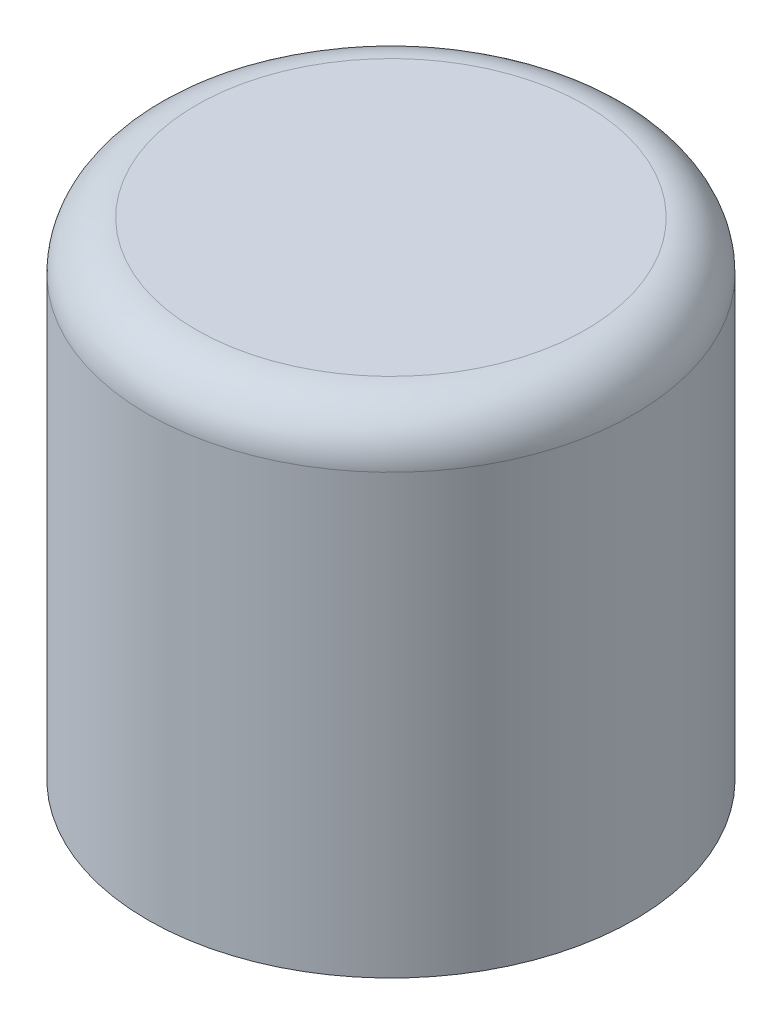
ISO-10303-21;
HEADER;
FILE_DESCRIPTION(('STEP AP214'),'2;1');
FILE_NAME('part.step','',(''),(''),'','','');
FILE_SCHEMA(('AUTOMOTIVE_DESIGN { 1 0 10303 214 1 1 1 1 }'));
ENDSEC;
DATA;
#1=APPLICATION_CONTEXT('core data for automotive mechanical design processes');
#2=APPLICATION_PROTOCOL_DEFINITION('international standard','automotive_design',2000,#1);
#3=PRODUCT_CONTEXT('',#1,'mechanical');
#4=PRODUCT('Part','Part','',(#3));
#5=PRODUCT_RELATED_PRODUCT_CATEGORY('part','',(#4));
#6=PRODUCT_DEFINITION_FORMATION('','',#4);
#7=PRODUCT_DEFINITION_CONTEXT('part definition',#1,'design');
#8=PRODUCT_DEFINITION('design','',#6,#7);
#9=PRODUCT_DEFINITION_SHAPE('','',#8);
#10=(LENGTH_UNIT() NAMED_UNIT(*) SI_UNIT(.MILLI.,.METRE.));
#11=(NAMED_UNIT(*) PLANE_ANGLE_UNIT() SI_UNIT($,.RADIAN.));
#12=(NAMED_UNIT(*) SI_UNIT($,.STERADIAN.) SOLID_ANGLE_UNIT());
#13=UNCERTAINTY_MEASURE_WITH_UNIT(LENGTH_MEASURE(1.E-05),#10,'distance_accuracy_value','');
#14=(GEOMETRIC_REPRESENTATION_CONTEXT(3) GLOBAL_UNCERTAINTY_ASSIGNED_CONTEXT((#13)) GLOBAL_UNIT_ASSIGNED_CONTEXT((#10,
#11,#12)) REPRESENTATION_CONTEXT('',''));
#15=CARTESIAN_POINT('',(0.,0.,0.));
#16=DIRECTION('',(0.,0.,1.));
#17=DIRECTION('',(1.,0.,0.));
#18=AXIS2_PLACEMENT_3D('',#15,#16,#17);
#19=CARTESIAN_POINT('',(0.,30.,0.));
#20=DIRECTION('',(0.,-1.,0.));
#21=DIRECTION('',(0.,0.,-1.));
#22=AXIS2_PLACEMENT_3D('',#19,#20,#21);
#23=CYLINDRICAL_SURFACE('',#22,15.);
#24=CARTESIAN_POINT('',(0.,27.,0.));
#25=DIRECTION('',(0.,1.,0.));
#26=DIRECTION('',(0.,0.,1.));
#27=AXIS2_PLACEMENT_3D('',#24,#25,#26);
#28=CIRCLE('',#27,15.);
#29=CARTESIAN_POINT('',(0.,27.,15.));
#30=VERTEX_POINT('',#29);
#31=EDGE_CURVE('E10',#30,#30,#28,.F.);
#32=ORIENTED_EDGE('',*,*,#31,.T.);
#33=EDGE_LOOP('',(#32));
#34=FACE_BOUND('',#33,.T.);
#35=CARTESIAN_POINT('',(0.,0.,0.));
#36=DIRECTION('',(0.,1.,0.));
#37=DIRECTION('',(0.,0.,1.));
#38=AXIS2_PLACEMENT_3D('',#35,#36,#37);
#39=CIRCLE('',#38,15.);
#40=CARTESIAN_POINT('',(0.,0.,15.));
#41=VERTEX_POINT('',#40);
#42=EDGE_CURVE('E45',#41,#41,#39,.T.);
#43=ORIENTED_EDGE('',*,*,#42,.T.);
#44=EDGE_LOOP('',(#43));
#45=FACE_BOUND('',#44,.T.);
#46=ADVANCED_FACE('F34',(#34,#45),#23,.T.);
#47=CARTESIAN_POINT('',(0.,30.,0.));
#48=DIRECTION('',(0.,1.,0.));
#49=DIRECTION('',(0.,0.,1.));
#50=AXIS2_PLACEMENT_3D('',#47,#48,#49);
#51=PLANE('',#50);
#52=CARTESIAN_POINT('',(0.,30.,0.));
#53=DIRECTION('',(0.,1.,0.));
#54=DIRECTION('',(0.,0.,1.));
#55=AXIS2_PLACEMENT_3D('',#52,#53,#54);
#56=CIRCLE('',#55,12.);
#57=CARTESIAN_POINT('',(0.,30.,12.));
#58=VERTEX_POINT('',#57);
#59=EDGE_CURVE('E41',#58,#58,#56,.T.);
#60=ORIENTED_EDGE('',*,*,#59,.T.);
#61=EDGE_LOOP('',(#60));
#62=FACE_BOUND('',#61,.T.);
#63=ADVANCED_FACE('F55',(#62),#51,.T.);
#64=CARTESIAN_POINT('',(0.,0.,0.));
#65=DIRECTION('',(0.,1.,0.));
#66=DIRECTION('',(0.,0.,1.));
#67=AXIS2_PLACEMENT_3D('',#64,#65,#66);
#68=PLANE('',#67);
#69=ORIENTED_EDGE('',*,*,#42,.F.);
#70=EDGE_LOOP('',(#69));
#71=FACE_BOUND('',#70,.T.);
#72=ADVANCED_FACE('F53',(#71),#68,.F.);
#73=CARTESIAN_POINT('',(0.,27.,0.));
#74=DIRECTION('',(0.,1.,0.));
#75=DIRECTION('',(0.,0.,1.));
#76=AXIS2_PLACEMENT_3D('',#73,#74,#75);
#77=TOROIDAL_SURFACE('',#76,12.,3.);
#78=ORIENTED_EDGE('',*,*,#31,.F.);
#79=EDGE_LOOP('',(#78));
#80=FACE_BOUND('',#79,.T.);
#81=ORIENTED_EDGE('',*,*,#59,.F.);
#82=EDGE_LOOP('',(#81));
#83=FACE_BOUND('',#82,.T.);
#84=ADVANCED_FACE('F36',(#80,#83),#77,.T.);
#85=CLOSED_SHELL('',(#46,#63,#72,#84));
#86=MANIFOLD_SOLID_BREP('B2',#85);
#87=ADVANCED_BREP_SHAPE_REPRESENTATION('',(#18,#86),#14);
#88=SHAPE_DEFINITION_REPRESENTATION(#9,#87);
ENDSEC;
END-ISO-10303-21;
